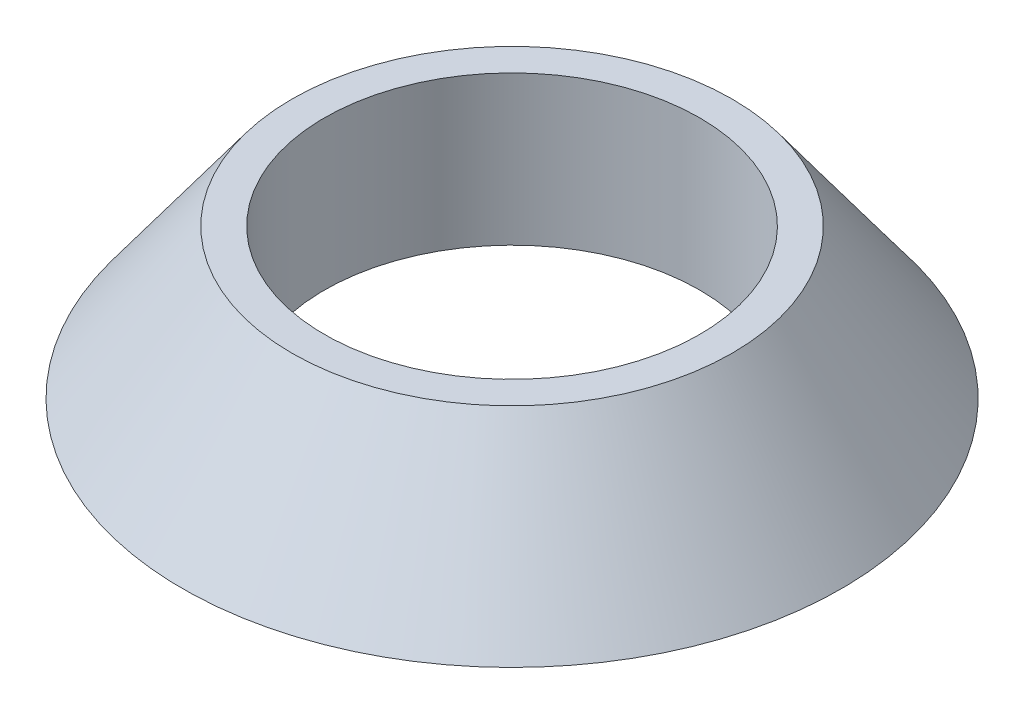
ISO-10303-21;
HEADER;
FILE_DESCRIPTION(('STEP AP214'),'2;1');
FILE_NAME('part.step','',(''),(''),'','','');
FILE_SCHEMA(('AUTOMOTIVE_DESIGN { 1 0 10303 214 1 1 1 1 }'));
ENDSEC;
DATA;
#1=APPLICATION_CONTEXT('core data for automotive mechanical design processes');
#2=APPLICATION_PROTOCOL_DEFINITION('international standard','automotive_design',2000,#1);
#3=PRODUCT_CONTEXT('',#1,'mechanical');
#4=PRODUCT('Part','Part','',(#3));
#5=PRODUCT_RELATED_PRODUCT_CATEGORY('part','',(#4));
#6=PRODUCT_DEFINITION_FORMATION('','',#4);
#7=PRODUCT_DEFINITION_CONTEXT('part definition',#1,'design');
#8=PRODUCT_DEFINITION('design','',#6,#7);
#9=PRODUCT_DEFINITION_SHAPE('','',#8);
#10=(LENGTH_UNIT() NAMED_UNIT(*) SI_UNIT(.MILLI.,.METRE.));
#11=(NAMED_UNIT(*) PLANE_ANGLE_UNIT() SI_UNIT($,.RADIAN.));
#12=(NAMED_UNIT(*) SI_UNIT($,.STERADIAN.) SOLID_ANGLE_UNIT());
#13=UNCERTAINTY_MEASURE_WITH_UNIT(LENGTH_MEASURE(1.E-05),#10,'distance_accuracy_value','');
#14=(GEOMETRIC_REPRESENTATION_CONTEXT(3) GLOBAL_UNCERTAINTY_ASSIGNED_CONTEXT((#13)) GLOBAL_UNIT_ASSIGNED_CONTEXT((#10,
#11,#12)) REPRESENTATION_CONTEXT('',''));
#15=CARTESIAN_POINT('',(0.,0.,0.));
#16=DIRECTION('',(0.,0.,1.));
#17=DIRECTION('',(1.,0.,0.));
#18=AXIS2_PLACEMENT_3D('',#15,#16,#17);
#19=CARTESIAN_POINT('',(36.4753124003372,0.,0.));
#20=DIRECTION('',(0.,-1.,0.));
#21=DIRECTION('',(0.,0.,-1.));
#22=AXIS2_PLACEMENT_3D('',#19,#20,#21);
#23=PLANE('',#22);
#24=CARTESIAN_POINT('',(0.,0.,0.));
#25=DIRECTION('',(0.,-1.,0.));
#26=DIRECTION('',(0.,0.,-1.));
#27=AXIS2_PLACEMENT_3D('',#24,#25,#26);
#28=CIRCLE('',#27,36.4753124003372);
#29=CARTESIAN_POINT('',(0.,0.,-36.4753124003372));
#30=VERTEX_POINT('',#29);
#31=EDGE_CURVE('E49',#30,#30,#28,.T.);
#32=ORIENTED_EDGE('',*,*,#31,.T.);
#33=EDGE_LOOP('',(#32));
#34=FACE_BOUND('',#33,.T.);
#35=CARTESIAN_POINT('',(0.,0.,0.));
#36=DIRECTION('',(0.,-1.,0.));
#37=DIRECTION('',(0.,0.,-1.));
#38=AXIS2_PLACEMENT_3D('',#35,#36,#37);
#39=CIRCLE('',#38,20.7686927934475);
#40=CARTESIAN_POINT('',(0.,0.,-20.7686927934475));
#41=VERTEX_POINT('',#40);
#42=EDGE_CURVE('E10',#41,#41,#39,.T.);
#43=ORIENTED_EDGE('',*,*,#42,.F.);
#44=EDGE_LOOP('',(#43));
#45=FACE_BOUND('',#44,.T.);
#46=ADVANCED_FACE('F35',(#34,#45),#23,.T.);
#47=CARTESIAN_POINT('',(0.,0.,0.));
#48=DIRECTION('',(0.,-1.,0.));
#49=DIRECTION('',(0.,0.,-1.));
#50=AXIS2_PLACEMENT_3D('',#47,#48,#49);
#51=CYLINDRICAL_SURFACE('',#50,20.7686927934475);
#52=ORIENTED_EDGE('',*,*,#42,.T.);
#53=EDGE_LOOP('',(#52));
#54=FACE_BOUND('',#53,.T.);
#55=CARTESIAN_POINT('',(0.,16.5108742253147,0.));
#56=DIRECTION('',(0.,-1.,0.));
#57=DIRECTION('',(0.,0.,-1.));
#58=AXIS2_PLACEMENT_3D('',#55,#56,#57);
#59=CIRCLE('',#58,20.7686927934475);
#60=CARTESIAN_POINT('',(0.,16.5108742253147,-20.7686927934475));
#61=VERTEX_POINT('',#60);
#62=EDGE_CURVE('E41',#61,#61,#59,.T.);
#63=ORIENTED_EDGE('',*,*,#62,.F.);
#64=EDGE_LOOP('',(#63));
#65=FACE_BOUND('',#64,.T.);
#66=ADVANCED_FACE('F65',(#54,#65),#51,.F.);
#67=CARTESIAN_POINT('',(20.7686927934475,16.5108742253147,0.));
#68=DIRECTION('',(0.,1.,0.));
#69=DIRECTION('',(0.,0.,1.));
#70=AXIS2_PLACEMENT_3D('',#67,#68,#69);
#71=PLANE('',#70);
#72=ORIENTED_EDGE('',*,*,#62,.T.);
#73=EDGE_LOOP('',(#72));
#74=FACE_BOUND('',#73,.T.);
#75=CARTESIAN_POINT('',(0.,16.5108742253147,0.));
#76=DIRECTION('',(0.,-1.,0.));
#77=DIRECTION('',(0.,0.,-1.));
#78=AXIS2_PLACEMENT_3D('',#75,#76,#77);
#79=CIRCLE('',#78,24.3641840287596);
#80=CARTESIAN_POINT('',(0.,16.5108742253147,-24.3641840287596));
#81=VERTEX_POINT('',#80);
#82=EDGE_CURVE('E45',#81,#81,#79,.T.);
#83=ORIENTED_EDGE('',*,*,#82,.F.);
#84=EDGE_LOOP('',(#83));
#85=FACE_BOUND('',#84,.T.);
#86=ADVANCED_FACE('F59',(#74,#85),#71,.T.);
#87=CARTESIAN_POINT('',(0.,0.,0.));
#88=DIRECTION('',(0.,-1.,0.));
#89=DIRECTION('',(0.,0.,-1.));
#90=AXIS2_PLACEMENT_3D('',#87,#88,#89);
#91=CONICAL_SURFACE('',#90,36.4753124003372,0.632873043174442);
#92=ORIENTED_EDGE('',*,*,#82,.T.);
#93=EDGE_LOOP('',(#92));
#94=FACE_BOUND('',#93,.T.);
#95=ORIENTED_EDGE('',*,*,#31,.F.);
#96=EDGE_LOOP('',(#95));
#97=FACE_BOUND('',#96,.T.);
#98=ADVANCED_FACE('F57',(#94,#97),#91,.T.);
#99=CLOSED_SHELL('',(#46,#66,#86,#98));
#100=MANIFOLD_SOLID_BREP('B2',#99);
#101=ADVANCED_BREP_SHAPE_REPRESENTATION('',(#18,#100),#14);
#102=SHAPE_DEFINITION_REPRESENTATION(#9,#101);
ENDSEC;
END-ISO-10303-21;
